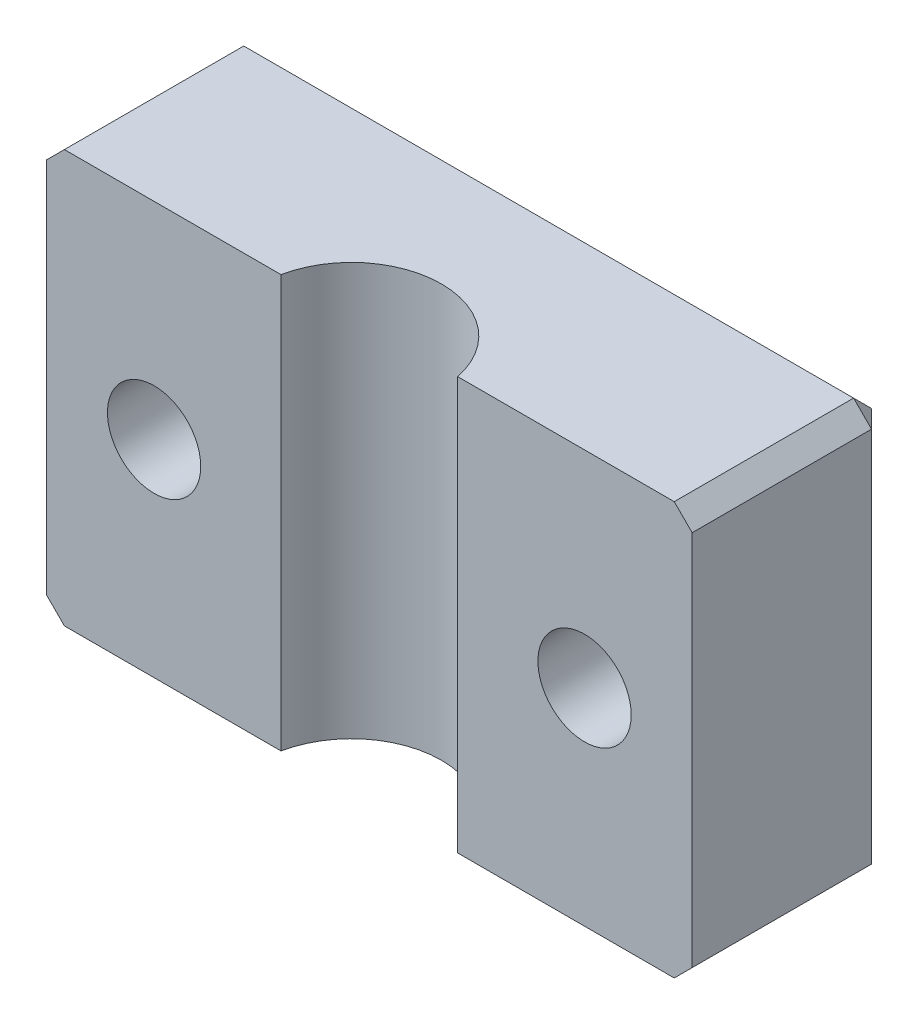
ISO-10303-21;
HEADER;
FILE_DESCRIPTION(('STEP AP214'),'2;1');
FILE_NAME('part.step','',(''),(''),'','','');
FILE_SCHEMA(('AUTOMOTIVE_DESIGN { 1 0 10303 214 1 1 1 1 }'));
ENDSEC;
DATA;
#1=APPLICATION_CONTEXT('core data for automotive mechanical design processes');
#2=APPLICATION_PROTOCOL_DEFINITION('international standard','automotive_design',2000,#1);
#3=PRODUCT_CONTEXT('',#1,'mechanical');
#4=PRODUCT('Part','Part','',(#3));
#5=PRODUCT_RELATED_PRODUCT_CATEGORY('part','',(#4));
#6=PRODUCT_DEFINITION_FORMATION('','',#4);
#7=PRODUCT_DEFINITION_CONTEXT('part definition',#1,'design');
#8=PRODUCT_DEFINITION('design','',#6,#7);
#9=PRODUCT_DEFINITION_SHAPE('','',#8);
#10=(LENGTH_UNIT() NAMED_UNIT(*) SI_UNIT(.MILLI.,.METRE.));
#11=(NAMED_UNIT(*) PLANE_ANGLE_UNIT() SI_UNIT($,.RADIAN.));
#12=(NAMED_UNIT(*) SI_UNIT($,.STERADIAN.) SOLID_ANGLE_UNIT());
#13=UNCERTAINTY_MEASURE_WITH_UNIT(LENGTH_MEASURE(1.E-05),#10,'distance_accuracy_value','');
#14=(GEOMETRIC_REPRESENTATION_CONTEXT(3) GLOBAL_UNCERTAINTY_ASSIGNED_CONTEXT((#13)) GLOBAL_UNIT_ASSIGNED_CONTEXT((#10,
#11,#12)) REPRESENTATION_CONTEXT('',''));
#15=CARTESIAN_POINT('',(0.,0.,0.));
#16=DIRECTION('',(0.,0.,1.));
#17=DIRECTION('',(1.,0.,0.));
#18=AXIS2_PLACEMENT_3D('',#15,#16,#17);
#19=CARTESIAN_POINT('',(-18.,23.,11.));
#20=DIRECTION('',(1.,0.,0.));
#21=DIRECTION('',(0.,0.,-1.));
#22=AXIS2_PLACEMENT_3D('',#19,#20,#21);
#23=PLANE('',#22);
#24=DIRECTION('',(0.,-1.,0.));
#25=VECTOR('',#24,1.);
#26=CARTESIAN_POINT('',(-18.,23.,1.));
#27=LINE('',#26,#25);
#28=CARTESIAN_POINT('',(-18.,22.,1.));
#29=VERTEX_POINT('',#28);
#30=CARTESIAN_POINT('',(-18.,1.,1.));
#31=VERTEX_POINT('',#30);
#32=EDGE_CURVE('E180',#29,#31,#27,.T.);
#33=ORIENTED_EDGE('',*,*,#32,.T.);
#34=DIRECTION('',(0.,0.,1.));
#35=VECTOR('',#34,1.);
#36=CARTESIAN_POINT('',(-18.,1.,11.));
#37=LINE('',#36,#35);
#38=CARTESIAN_POINT('',(-18.,1.00000000000001,11.));
#39=VERTEX_POINT('',#38);
#40=EDGE_CURVE('E184',#31,#39,#37,.T.);
#41=ORIENTED_EDGE('',*,*,#40,.T.);
#42=DIRECTION('',(0.,-1.,0.));
#43=VECTOR('',#42,1.);
#44=CARTESIAN_POINT('',(-18.,23.,11.));
#45=LINE('',#44,#43);
#46=CARTESIAN_POINT('',(-18.,22.,11.));
#47=VERTEX_POINT('',#46);
#48=EDGE_CURVE('E141',#47,#39,#45,.T.);
#49=ORIENTED_EDGE('',*,*,#48,.F.);
#50=DIRECTION('',(0.,0.,-1.));
#51=VECTOR('',#50,1.);
#52=CARTESIAN_POINT('',(-18.,22.,0.));
#53=LINE('',#52,#51);
#54=EDGE_CURVE('E182',#47,#29,#53,.T.);
#55=ORIENTED_EDGE('',*,*,#54,.T.);
#56=EDGE_LOOP('',(#33,#41,#49,#55));
#57=FACE_BOUND('',#56,.T.);
#58=ADVANCED_FACE('F33',(#57),#23,.F.);
#59=CARTESIAN_POINT('',(-4.92449235962449,23.,11.));
#60=DIRECTION('',(0.,0.,-1.));
#61=DIRECTION('',(-1.,0.,0.));
#62=AXIS2_PLACEMENT_3D('',#59,#60,#61);
#63=PLANE('',#62);
#64=CARTESIAN_POINT('',(-12.,11.5,11.));
#65=DIRECTION('',(0.,0.,1.));
#66=DIRECTION('',(1.,0.,0.));
#67=AXIS2_PLACEMENT_3D('',#64,#65,#66);
#68=CIRCLE('',#67,2.6);
#69=CARTESIAN_POINT('',(-9.4,11.5,11.));
#70=VERTEX_POINT('',#69);
#71=EDGE_CURVE('E243',#70,#70,#68,.T.);
#72=ORIENTED_EDGE('',*,*,#71,.F.);
#73=EDGE_LOOP('',(#72));
#74=FACE_BOUND('',#73,.T.);
#75=ORIENTED_EDGE('',*,*,#48,.T.);
#76=DIRECTION('',(-0.707106781186549,0.707106781186546,0.));
#77=VECTOR('',#76,1.);
#78=CARTESIAN_POINT('',(-18.,1.,11.));
#79=LINE('',#78,#77);
#80=CARTESIAN_POINT('',(-17.,0.,11.));
#81=VERTEX_POINT('',#80);
#82=EDGE_CURVE('E188',#39,#81,#79,.F.);
#83=ORIENTED_EDGE('',*,*,#82,.T.);
#84=DIRECTION('',(1.,0.,0.));
#85=VECTOR('',#84,1.);
#86=CARTESIAN_POINT('',(-4.92449235962449,0.,11.));
#87=LINE('',#86,#85);
#88=CARTESIAN_POINT('',(-4.92449235962449,0.,11.));
#89=VERTEX_POINT('',#88);
#90=EDGE_CURVE('E138',#81,#89,#87,.T.);
#91=ORIENTED_EDGE('',*,*,#90,.T.);
#92=DIRECTION('',(0.,-1.,0.));
#93=VECTOR('',#92,1.);
#94=CARTESIAN_POINT('',(-4.92449235962449,23.,11.));
#95=LINE('',#94,#93);
#96=CARTESIAN_POINT('',(-4.92449235962449,23.,11.));
#97=VERTEX_POINT('',#96);
#98=EDGE_CURVE('E134',#97,#89,#95,.T.);
#99=ORIENTED_EDGE('',*,*,#98,.F.);
#100=DIRECTION('',(1.,0.,0.));
#101=VECTOR('',#100,1.);
#102=CARTESIAN_POINT('',(-4.92449235962449,23.,11.));
#103=LINE('',#102,#101);
#104=CARTESIAN_POINT('',(-17.,23.,11.));
#105=VERTEX_POINT('',#104);
#106=EDGE_CURVE('E120',#105,#97,#103,.T.);
#107=ORIENTED_EDGE('',*,*,#106,.F.);
#108=DIRECTION('',(-0.707106781186546,-0.707106781186549,0.));
#109=VECTOR('',#108,1.);
#110=CARTESIAN_POINT('',(-17.,23.,11.));
#111=LINE('',#110,#109);
#112=EDGE_CURVE('E186',#105,#47,#111,.T.);
#113=ORIENTED_EDGE('',*,*,#112,.T.);
#114=EDGE_LOOP('',(#75,#83,#91,#99,#107,#113));
#115=FACE_BOUND('',#114,.T.);
#116=ADVANCED_FACE('F136',(#74,#115),#63,.F.);
#117=CARTESIAN_POINT('',(0.,23.,12.));
#118=DIRECTION('',(0.,-1.,0.));
#119=DIRECTION('',(0.,0.,-1.));
#120=AXIS2_PLACEMENT_3D('',#117,#118,#119);
#121=CYLINDRICAL_SURFACE('',#120,5.025);
#122=CARTESIAN_POINT('',(0.,0.,12.));
#123=DIRECTION('',(0.,-1.,0.));
#124=DIRECTION('',(0.,0.,1.));
#125=AXIS2_PLACEMENT_3D('',#122,#123,#124);
#126=CIRCLE('',#125,5.025);
#127=CARTESIAN_POINT('',(4.9244923596245,0.,11.));
#128=VERTEX_POINT('',#127);
#129=EDGE_CURVE('E154',#89,#128,#126,.T.);
#130=ORIENTED_EDGE('',*,*,#129,.T.);
#131=DIRECTION('',(0.,-1.,0.));
#132=VECTOR('',#131,1.);
#133=CARTESIAN_POINT('',(4.9244923596245,23.,11.));
#134=LINE('',#133,#132);
#135=CARTESIAN_POINT('',(4.9244923596245,23.,11.));
#136=VERTEX_POINT('',#135);
#137=EDGE_CURVE('E142',#136,#128,#134,.T.);
#138=ORIENTED_EDGE('',*,*,#137,.F.);
#139=CARTESIAN_POINT('',(0.,23.,12.));
#140=DIRECTION('',(0.,-1.,0.));
#141=DIRECTION('',(0.,0.,1.));
#142=AXIS2_PLACEMENT_3D('',#139,#140,#141);
#143=CIRCLE('',#142,5.025);
#144=EDGE_CURVE('E125',#97,#136,#143,.T.);
#145=ORIENTED_EDGE('',*,*,#144,.F.);
#146=ORIENTED_EDGE('',*,*,#98,.T.);
#147=EDGE_LOOP('',(#130,#138,#145,#146));
#148=FACE_BOUND('',#147,.T.);
#149=ADVANCED_FACE('F144',(#148),#121,.F.);
#150=CARTESIAN_POINT('',(18.,23.,11.));
#151=DIRECTION('',(0.,0.,-1.));
#152=DIRECTION('',(-1.,0.,0.));
#153=AXIS2_PLACEMENT_3D('',#150,#151,#152);
#154=PLANE('',#153);
#155=CARTESIAN_POINT('',(12.,11.5,11.));
#156=DIRECTION('',(0.,0.,1.));
#157=DIRECTION('',(1.,0.,0.));
#158=AXIS2_PLACEMENT_3D('',#155,#156,#157);
#159=CIRCLE('',#158,2.6);
#160=CARTESIAN_POINT('',(14.6,11.5,11.));
#161=VERTEX_POINT('',#160);
#162=EDGE_CURVE('E233',#161,#161,#159,.T.);
#163=ORIENTED_EDGE('',*,*,#162,.F.);
#164=EDGE_LOOP('',(#163));
#165=FACE_BOUND('',#164,.T.);
#166=DIRECTION('',(1.,0.,0.));
#167=VECTOR('',#166,1.);
#168=CARTESIAN_POINT('',(18.,0.,11.));
#169=LINE('',#168,#167);
#170=CARTESIAN_POINT('',(17.,0.,11.));
#171=VERTEX_POINT('',#170);
#172=EDGE_CURVE('E131',#128,#171,#169,.T.);
#173=ORIENTED_EDGE('',*,*,#172,.T.);
#174=DIRECTION('',(-0.707106781186549,-0.707106781186546,0.));
#175=VECTOR('',#174,1.);
#176=CARTESIAN_POINT('',(18.,1.,11.));
#177=LINE('',#176,#175);
#178=CARTESIAN_POINT('',(18.,1.00000000000001,11.));
#179=VERTEX_POINT('',#178);
#180=EDGE_CURVE('E178',#171,#179,#177,.F.);
#181=ORIENTED_EDGE('',*,*,#180,.T.);
#182=DIRECTION('',(0.,-1.,0.));
#183=VECTOR('',#182,1.);
#184=CARTESIAN_POINT('',(18.,23.,11.));
#185=LINE('',#184,#183);
#186=CARTESIAN_POINT('',(18.,22.,11.));
#187=VERTEX_POINT('',#186);
#188=EDGE_CURVE('E149',#187,#179,#185,.T.);
#189=ORIENTED_EDGE('',*,*,#188,.F.);
#190=DIRECTION('',(-0.707106781186546,0.707106781186549,0.));
#191=VECTOR('',#190,1.);
#192=CARTESIAN_POINT('',(17.,23.,11.));
#193=LINE('',#192,#191);
#194=CARTESIAN_POINT('',(17.,23.,11.));
#195=VERTEX_POINT('',#194);
#196=EDGE_CURVE('E176',#187,#195,#193,.T.);
#197=ORIENTED_EDGE('',*,*,#196,.T.);
#198=DIRECTION('',(1.,0.,0.));
#199=VECTOR('',#198,1.);
#200=CARTESIAN_POINT('',(18.,23.,11.));
#201=LINE('',#200,#199);
#202=EDGE_CURVE('E147',#136,#195,#201,.T.);
#203=ORIENTED_EDGE('',*,*,#202,.F.);
#204=ORIENTED_EDGE('',*,*,#137,.T.);
#205=EDGE_LOOP('',(#173,#181,#189,#197,#203,#204));
#206=FACE_BOUND('',#205,.T.);
#207=ADVANCED_FACE('F262',(#165,#206),#154,.F.);
#208=CARTESIAN_POINT('',(18.,23.,0.));
#209=DIRECTION('',(-1.,0.,0.));
#210=DIRECTION('',(0.,0.,1.));
#211=AXIS2_PLACEMENT_3D('',#208,#209,#210);
#212=PLANE('',#211);
#213=ORIENTED_EDGE('',*,*,#188,.T.);
#214=DIRECTION('',(0.,0.,-1.));
#215=VECTOR('',#214,1.);
#216=CARTESIAN_POINT('',(18.,1.,0.));
#217=LINE('',#216,#215);
#218=CARTESIAN_POINT('',(18.,1.,0.999999999999997));
#219=VERTEX_POINT('',#218);
#220=EDGE_CURVE('E167',#179,#219,#217,.T.);
#221=ORIENTED_EDGE('',*,*,#220,.T.);
#222=DIRECTION('',(0.,1.,0.));
#223=VECTOR('',#222,1.);
#224=CARTESIAN_POINT('',(18.,23.,0.999999999999997));
#225=LINE('',#224,#223);
#226=CARTESIAN_POINT('',(18.,22.,0.999999999999997));
#227=VERTEX_POINT('',#226);
#228=EDGE_CURVE('E163',#219,#227,#225,.T.);
#229=ORIENTED_EDGE('',*,*,#228,.T.);
#230=DIRECTION('',(0.,0.,1.));
#231=VECTOR('',#230,1.);
#232=CARTESIAN_POINT('',(18.,22.,11.));
#233=LINE('',#232,#231);
#234=EDGE_CURVE('E165',#227,#187,#233,.T.);
#235=ORIENTED_EDGE('',*,*,#234,.T.);
#236=EDGE_LOOP('',(#213,#221,#229,#235));
#237=FACE_BOUND('',#236,.T.);
#238=ADVANCED_FACE('F254',(#237),#212,.F.);
#239=CARTESIAN_POINT('',(-18.,23.,0.));
#240=DIRECTION('',(0.,0.,1.));
#241=DIRECTION('',(1.,0.,0.));
#242=AXIS2_PLACEMENT_3D('',#239,#240,#241);
#243=PLANE('',#242);
#244=DIRECTION('',(-1.,0.,0.));
#245=VECTOR('',#244,1.);
#246=CARTESIAN_POINT('',(-18.,1.,0.));
#247=LINE('',#246,#245);
#248=CARTESIAN_POINT('',(17.,1.,0.));
#249=VERTEX_POINT('',#248);
#250=CARTESIAN_POINT('',(-17.,1.,0.));
#251=VERTEX_POINT('',#250);
#252=EDGE_CURVE('E42',#249,#251,#247,.T.);
#253=ORIENTED_EDGE('',*,*,#252,.T.);
#254=DIRECTION('',(0.,1.,0.));
#255=VECTOR('',#254,1.);
#256=CARTESIAN_POINT('',(-17.,23.,0.));
#257=LINE('',#256,#255);
#258=CARTESIAN_POINT('',(-17.,22.,0.));
#259=VERTEX_POINT('',#258);
#260=EDGE_CURVE('E11',#251,#259,#257,.T.);
#261=ORIENTED_EDGE('',*,*,#260,.T.);
#262=DIRECTION('',(1.,0.,0.));
#263=VECTOR('',#262,1.);
#264=CARTESIAN_POINT('',(18.,22.,0.));
#265=LINE('',#264,#263);
#266=CARTESIAN_POINT('',(17.,22.,0.));
#267=VERTEX_POINT('',#266);
#268=EDGE_CURVE('E195',#259,#267,#265,.T.);
#269=ORIENTED_EDGE('',*,*,#268,.T.);
#270=DIRECTION('',(0.,-1.,0.));
#271=VECTOR('',#270,1.);
#272=CARTESIAN_POINT('',(17.,23.,0.));
#273=LINE('',#272,#271);
#274=EDGE_CURVE('E53',#267,#249,#273,.T.);
#275=ORIENTED_EDGE('',*,*,#274,.T.);
#276=EDGE_LOOP('',(#253,#261,#269,#275));
#277=FACE_BOUND('',#276,.T.);
#278=CARTESIAN_POINT('',(12.,11.5,0.));
#279=DIRECTION('',(0.,0.,1.));
#280=DIRECTION('',(1.,0.,0.));
#281=AXIS2_PLACEMENT_3D('',#278,#279,#280);
#282=CIRCLE('',#281,2.6);
#283=CARTESIAN_POINT('',(14.6,11.5,0.));
#284=VERTEX_POINT('',#283);
#285=EDGE_CURVE('E238',#284,#284,#282,.F.);
#286=ORIENTED_EDGE('',*,*,#285,.F.);
#287=EDGE_LOOP('',(#286));
#288=FACE_BOUND('',#287,.T.);
#289=CARTESIAN_POINT('',(-12.,11.5,0.));
#290=DIRECTION('',(0.,0.,1.));
#291=DIRECTION('',(1.,0.,0.));
#292=AXIS2_PLACEMENT_3D('',#289,#290,#291);
#293=CIRCLE('',#292,2.6);
#294=CARTESIAN_POINT('',(-9.4,11.5,0.));
#295=VERTEX_POINT('',#294);
#296=EDGE_CURVE('E155',#295,#295,#293,.F.);
#297=ORIENTED_EDGE('',*,*,#296,.F.);
#298=EDGE_LOOP('',(#297));
#299=FACE_BOUND('',#298,.T.);
#300=ADVANCED_FACE('F252',(#277,#288,#299),#243,.F.);
#301=CARTESIAN_POINT('',(0.,23.,12.));
#302=DIRECTION('',(0.,1.,0.));
#303=DIRECTION('',(0.,0.,1.));
#304=AXIS2_PLACEMENT_3D('',#301,#302,#303);
#305=PLANE('',#304);
#306=DIRECTION('',(-1.,0.,0.));
#307=VECTOR('',#306,1.);
#308=CARTESIAN_POINT('',(-18.,23.,1.));
#309=LINE('',#308,#307);
#310=CARTESIAN_POINT('',(17.,23.,0.999999999999997));
#311=VERTEX_POINT('',#310);
#312=CARTESIAN_POINT('',(-17.,23.,1.));
#313=VERTEX_POINT('',#312);
#314=EDGE_CURVE('E190',#311,#313,#309,.T.);
#315=ORIENTED_EDGE('',*,*,#314,.T.);
#316=DIRECTION('',(0.,0.,1.));
#317=VECTOR('',#316,1.);
#318=CARTESIAN_POINT('',(-17.,23.,11.));
#319=LINE('',#318,#317);
#320=EDGE_CURVE('E128',#313,#105,#319,.T.);
#321=ORIENTED_EDGE('',*,*,#320,.T.);
#322=ORIENTED_EDGE('',*,*,#106,.T.);
#323=ORIENTED_EDGE('',*,*,#144,.T.);
#324=ORIENTED_EDGE('',*,*,#202,.T.);
#325=DIRECTION('',(0.,0.,-1.));
#326=VECTOR('',#325,1.);
#327=CARTESIAN_POINT('',(17.,23.,0.));
#328=LINE('',#327,#326);
#329=EDGE_CURVE('E192',#195,#311,#328,.T.);
#330=ORIENTED_EDGE('',*,*,#329,.T.);
#331=EDGE_LOOP('',(#315,#321,#322,#323,#324,#330));
#332=FACE_BOUND('',#331,.T.);
#333=ADVANCED_FACE('F122',(#332),#305,.T.);
#334=CARTESIAN_POINT('',(0.,0.,12.));
#335=DIRECTION('',(0.,1.,0.));
#336=DIRECTION('',(0.,0.,1.));
#337=AXIS2_PLACEMENT_3D('',#334,#335,#336);
#338=PLANE('',#337);
#339=DIRECTION('',(1.,0.,0.));
#340=VECTOR('',#339,1.);
#341=CARTESIAN_POINT('',(0.,0.,0.999999999999999));
#342=LINE('',#341,#340);
#343=CARTESIAN_POINT('',(-17.,0.,1.));
#344=VERTEX_POINT('',#343);
#345=CARTESIAN_POINT('',(17.,0.,0.999999999999997));
#346=VERTEX_POINT('',#345);
#347=EDGE_CURVE('E170',#344,#346,#342,.T.);
#348=ORIENTED_EDGE('',*,*,#347,.T.);
#349=DIRECTION('',(0.,0.,1.));
#350=VECTOR('',#349,1.);
#351=CARTESIAN_POINT('',(17.,0.,12.));
#352=LINE('',#351,#350);
#353=EDGE_CURVE('E174',#346,#171,#352,.T.);
#354=ORIENTED_EDGE('',*,*,#353,.T.);
#355=ORIENTED_EDGE('',*,*,#172,.F.);
#356=ORIENTED_EDGE('',*,*,#129,.F.);
#357=ORIENTED_EDGE('',*,*,#90,.F.);
#358=DIRECTION('',(0.,0.,-1.));
#359=VECTOR('',#358,1.);
#360=CARTESIAN_POINT('',(-17.,0.,12.));
#361=LINE('',#360,#359);
#362=EDGE_CURVE('E172',#81,#344,#361,.T.);
#363=ORIENTED_EDGE('',*,*,#362,.T.);
#364=EDGE_LOOP('',(#348,#354,#355,#356,#357,#363));
#365=FACE_BOUND('',#364,.T.);
#366=ADVANCED_FACE('F260',(#365),#338,.F.);
#367=CARTESIAN_POINT('',(-12.,11.5,-0.00100000000000447));
#368=DIRECTION('',(0.,0.,1.));
#369=DIRECTION('',(1.,0.,0.));
#370=AXIS2_PLACEMENT_3D('',#367,#368,#369);
#371=CYLINDRICAL_SURFACE('',#370,2.6);
#372=ORIENTED_EDGE('',*,*,#71,.T.);
#373=EDGE_LOOP('',(#372));
#374=FACE_BOUND('',#373,.T.);
#375=ORIENTED_EDGE('',*,*,#296,.T.);
#376=EDGE_LOOP('',(#375));
#377=FACE_BOUND('',#376,.T.);
#378=ADVANCED_FACE('F250',(#374,#377),#371,.F.);
#379=CARTESIAN_POINT('',(12.,11.5,-0.00100000000000447));
#380=DIRECTION('',(0.,0.,1.));
#381=DIRECTION('',(1.,0.,0.));
#382=AXIS2_PLACEMENT_3D('',#379,#380,#381);
#383=CYLINDRICAL_SURFACE('',#382,2.6);
#384=ORIENTED_EDGE('',*,*,#162,.T.);
#385=EDGE_LOOP('',(#384));
#386=FACE_BOUND('',#385,.T.);
#387=ORIENTED_EDGE('',*,*,#285,.T.);
#388=EDGE_LOOP('',(#387));
#389=FACE_BOUND('',#388,.T.);
#390=ADVANCED_FACE('F320',(#386,#389),#383,.F.);
#391=CARTESIAN_POINT('',(-17.,23.,12.));
#392=DIRECTION('',(-0.707106781186549,0.707106781186546,0.));
#393=DIRECTION('',(0.,0.,-1.));
#394=AXIS2_PLACEMENT_3D('',#391,#392,#393);
#395=PLANE('',#394);
#396=DIRECTION('',(0.707106781186546,0.707106781186549,0.));
#397=VECTOR('',#396,1.);
#398=CARTESIAN_POINT('',(-18.,22.,1.));
#399=LINE('',#398,#397);
#400=EDGE_CURVE('E37',#29,#313,#399,.T.);
#401=ORIENTED_EDGE('',*,*,#400,.F.);
#402=ORIENTED_EDGE('',*,*,#54,.F.);
#403=ORIENTED_EDGE('',*,*,#112,.F.);
#404=ORIENTED_EDGE('',*,*,#320,.F.);
#405=EDGE_LOOP('',(#401,#402,#403,#404));
#406=FACE_BOUND('',#405,.T.);
#407=ADVANCED_FACE('F35',(#406),#395,.T.);
#408=CARTESIAN_POINT('',(-18.,22.,1.));
#409=DIRECTION('',(-0.577350269189626,0.577350269189624,-0.577350269189628));
#410=DIRECTION('',(-0.707106781186549,0.,0.707106781186546));
#411=AXIS2_PLACEMENT_3D('',#408,#409,#410);
#412=PLANE('',#411);
#413=DIRECTION('',(0.707106781186549,0.,-0.707106781186546));
#414=VECTOR('',#413,1.);
#415=CARTESIAN_POINT('',(-18.,22.,1.));
#416=LINE('',#415,#414);
#417=EDGE_CURVE('E225',#29,#259,#416,.T.);
#418=ORIENTED_EDGE('',*,*,#417,.F.);
#419=ORIENTED_EDGE('',*,*,#400,.T.);
#420=DIRECTION('',(0.,-0.707106781186549,-0.707106781186546));
#421=VECTOR('',#420,1.);
#422=CARTESIAN_POINT('',(-17.,22.5,0.5));
#423=LINE('',#422,#421);
#424=EDGE_CURVE('E227',#259,#313,#423,.F.);
#425=ORIENTED_EDGE('',*,*,#424,.F.);
#426=EDGE_LOOP('',(#418,#419,#425));
#427=FACE_BOUND('',#426,.T.);
#428=ADVANCED_FACE('F314',(#427),#412,.T.);
#429=CARTESIAN_POINT('',(17.,23.,12.));
#430=DIRECTION('',(0.707106781186549,0.707106781186546,0.));
#431=DIRECTION('',(0.,0.,1.));
#432=AXIS2_PLACEMENT_3D('',#429,#430,#431);
#433=PLANE('',#432);
#434=ORIENTED_EDGE('',*,*,#196,.F.);
#435=ORIENTED_EDGE('',*,*,#234,.F.);
#436=DIRECTION('',(0.707106781186546,-0.707106781186549,0.));
#437=VECTOR('',#436,1.);
#438=CARTESIAN_POINT('',(17.,23.,0.999999999999997));
#439=LINE('',#438,#437);
#440=EDGE_CURVE('E222',#311,#227,#439,.T.);
#441=ORIENTED_EDGE('',*,*,#440,.F.);
#442=ORIENTED_EDGE('',*,*,#329,.F.);
#443=EDGE_LOOP('',(#434,#435,#441,#442));
#444=FACE_BOUND('',#443,.T.);
#445=ADVANCED_FACE('F312',(#444),#433,.T.);
#446=CARTESIAN_POINT('',(0.,23.,0.999999999999999));
#447=DIRECTION('',(0.,0.707106781186546,-0.707106781186549));
#448=DIRECTION('',(1.,0.,0.));
#449=AXIS2_PLACEMENT_3D('',#446,#447,#448);
#450=PLANE('',#449);
#451=ORIENTED_EDGE('',*,*,#424,.T.);
#452=ORIENTED_EDGE('',*,*,#314,.F.);
#453=DIRECTION('',(0.,0.707106781186548,0.707106781186546));
#454=VECTOR('',#453,1.);
#455=CARTESIAN_POINT('',(17.,23.,0.999999999999997));
#456=LINE('',#455,#454);
#457=EDGE_CURVE('E219',#267,#311,#456,.T.);
#458=ORIENTED_EDGE('',*,*,#457,.F.);
#459=ORIENTED_EDGE('',*,*,#268,.F.);
#460=EDGE_LOOP('',(#451,#452,#458,#459));
#461=FACE_BOUND('',#460,.T.);
#462=ADVANCED_FACE('F308',(#461),#450,.T.);
#463=CARTESIAN_POINT('',(-18.,23.,1.));
#464=DIRECTION('',(0.707106781186546,0.,0.707106781186549));
#465=DIRECTION('',(0.,-1.,0.));
#466=AXIS2_PLACEMENT_3D('',#463,#464,#465);
#467=PLANE('',#466);
#468=ORIENTED_EDGE('',*,*,#417,.T.);
#469=ORIENTED_EDGE('',*,*,#260,.F.);
#470=DIRECTION('',(-0.707106781186549,0.,0.707106781186546));
#471=VECTOR('',#470,1.);
#472=CARTESIAN_POINT('',(-17.5,1.,0.5));
#473=LINE('',#472,#471);
#474=EDGE_CURVE('E216',#31,#251,#473,.F.);
#475=ORIENTED_EDGE('',*,*,#474,.F.);
#476=ORIENTED_EDGE('',*,*,#32,.F.);
#477=EDGE_LOOP('',(#468,#469,#475,#476));
#478=FACE_BOUND('',#477,.T.);
#479=ADVANCED_FACE('F304',(#478),#467,.F.);
#480=CARTESIAN_POINT('',(-18.,1.,11.));
#481=DIRECTION('',(0.707106781186546,0.707106781186549,0.));
#482=DIRECTION('',(0.,0.,1.));
#483=AXIS2_PLACEMENT_3D('',#480,#481,#482);
#484=PLANE('',#483);
#485=ORIENTED_EDGE('',*,*,#82,.F.);
#486=ORIENTED_EDGE('',*,*,#40,.F.);
#487=DIRECTION('',(0.707106781186549,-0.707106781186546,0.));
#488=VECTOR('',#487,1.);
#489=CARTESIAN_POINT('',(-17.,0.,1.));
#490=LINE('',#489,#488);
#491=EDGE_CURVE('E213',#344,#31,#490,.F.);
#492=ORIENTED_EDGE('',*,*,#491,.F.);
#493=ORIENTED_EDGE('',*,*,#362,.F.);
#494=EDGE_LOOP('',(#485,#486,#492,#493));
#495=FACE_BOUND('',#494,.T.);
#496=ADVANCED_FACE('F300',(#495),#484,.F.);
#497=CARTESIAN_POINT('',(17.,23.,0.999999999999997));
#498=DIRECTION('',(0.577350269189625,0.577350269189623,-0.577350269189629));
#499=DIRECTION('',(-0.70710678118655,0.,-0.707106781186545));
#500=AXIS2_PLACEMENT_3D('',#497,#498,#499);
#501=PLANE('',#500);
#502=ORIENTED_EDGE('',*,*,#457,.T.);
#503=ORIENTED_EDGE('',*,*,#440,.T.);
#504=DIRECTION('',(0.70710678118655,0.,0.707106781186545));
#505=VECTOR('',#504,1.);
#506=CARTESIAN_POINT('',(17.5,22.,0.499999999999996));
#507=LINE('',#506,#505);
#508=EDGE_CURVE('E210',#267,#227,#507,.T.);
#509=ORIENTED_EDGE('',*,*,#508,.F.);
#510=EDGE_LOOP('',(#502,#503,#509));
#511=FACE_BOUND('',#510,.T.);
#512=ADVANCED_FACE('F296',(#511),#501,.T.);
#513=CARTESIAN_POINT('',(-17.,0.,1.));
#514=DIRECTION('',(-0.577350269189624,-0.577350269189626,-0.577350269189628));
#515=DIRECTION('',(0.,0.707106781186548,-0.707106781186547));
#516=AXIS2_PLACEMENT_3D('',#513,#514,#515);
#517=PLANE('',#516);
#518=ORIENTED_EDGE('',*,*,#491,.T.);
#519=ORIENTED_EDGE('',*,*,#474,.T.);
#520=DIRECTION('',(0.,0.707106781186549,-0.707106781186546));
#521=VECTOR('',#520,1.);
#522=CARTESIAN_POINT('',(-17.,0.,1.));
#523=LINE('',#522,#521);
#524=EDGE_CURVE('E207',#344,#251,#523,.T.);
#525=ORIENTED_EDGE('',*,*,#524,.F.);
#526=EDGE_LOOP('',(#518,#519,#525));
#527=FACE_BOUND('',#526,.T.);
#528=ADVANCED_FACE('F292',(#527),#517,.T.);
#529=CARTESIAN_POINT('',(17.,23.,0.));
#530=DIRECTION('',(-0.707106781186545,0.,0.70710678118655));
#531=DIRECTION('',(0.,-1.,0.));
#532=AXIS2_PLACEMENT_3D('',#529,#530,#531);
#533=PLANE('',#532);
#534=ORIENTED_EDGE('',*,*,#508,.T.);
#535=ORIENTED_EDGE('',*,*,#228,.F.);
#536=DIRECTION('',(-0.70710678118655,0.,-0.707106781186545));
#537=VECTOR('',#536,1.);
#538=CARTESIAN_POINT('',(18.,1.,0.999999999999997));
#539=LINE('',#538,#537);
#540=EDGE_CURVE('E204',#249,#219,#539,.F.);
#541=ORIENTED_EDGE('',*,*,#540,.F.);
#542=ORIENTED_EDGE('',*,*,#274,.F.);
#543=EDGE_LOOP('',(#534,#535,#541,#542));
#544=FACE_BOUND('',#543,.T.);
#545=ADVANCED_FACE('F288',(#544),#533,.F.);
#546=CARTESIAN_POINT('',(-18.,1.,0.));
#547=DIRECTION('',(0.,0.707106781186546,0.707106781186549));
#548=DIRECTION('',(-1.,0.,0.));
#549=AXIS2_PLACEMENT_3D('',#546,#547,#548);
#550=PLANE('',#549);
#551=ORIENTED_EDGE('',*,*,#524,.T.);
#552=ORIENTED_EDGE('',*,*,#252,.F.);
#553=DIRECTION('',(0.,-0.707106781186549,0.707106781186547));
#554=VECTOR('',#553,1.);
#555=CARTESIAN_POINT('',(17.,0.500000000000001,0.499999999999998));
#556=LINE('',#555,#554);
#557=EDGE_CURVE('E201',#346,#249,#556,.F.);
#558=ORIENTED_EDGE('',*,*,#557,.F.);
#559=ORIENTED_EDGE('',*,*,#347,.F.);
#560=EDGE_LOOP('',(#551,#552,#558,#559));
#561=FACE_BOUND('',#560,.T.);
#562=ADVANCED_FACE('F284',(#561),#550,.F.);
#563=CARTESIAN_POINT('',(18.,1.,0.999999999999997));
#564=DIRECTION('',(0.577350269189623,-0.577350269189625,-0.577350269189629));
#565=DIRECTION('',(0.,0.70710678118655,-0.707106781186545));
#566=AXIS2_PLACEMENT_3D('',#563,#564,#565);
#567=PLANE('',#566);
#568=ORIENTED_EDGE('',*,*,#557,.T.);
#569=ORIENTED_EDGE('',*,*,#540,.T.);
#570=DIRECTION('',(0.707106781186549,0.707106781186546,0.));
#571=VECTOR('',#570,1.);
#572=CARTESIAN_POINT('',(18.,1.,0.999999999999997));
#573=LINE('',#572,#571);
#574=EDGE_CURVE('E199',#346,#219,#573,.T.);
#575=ORIENTED_EDGE('',*,*,#574,.F.);
#576=EDGE_LOOP('',(#568,#569,#575));
#577=FACE_BOUND('',#576,.T.);
#578=ADVANCED_FACE('F280',(#577),#567,.T.);
#579=CARTESIAN_POINT('',(18.,1.,0.));
#580=DIRECTION('',(-0.707106781186546,0.707106781186549,0.));
#581=DIRECTION('',(0.,0.,-1.));
#582=AXIS2_PLACEMENT_3D('',#579,#580,#581);
#583=PLANE('',#582);
#584=ORIENTED_EDGE('',*,*,#180,.F.);
#585=ORIENTED_EDGE('',*,*,#353,.F.);
#586=ORIENTED_EDGE('',*,*,#574,.T.);
#587=ORIENTED_EDGE('',*,*,#220,.F.);
#588=EDGE_LOOP('',(#584,#585,#586,#587));
#589=FACE_BOUND('',#588,.T.);
#590=ADVANCED_FACE('F277',(#589),#583,.F.);
#591=CLOSED_SHELL('',(#58,#116,#149,#207,#238,#300,#333,#366,#378,#390,#407,#428,#445,#462,#479,
#496,#512,#528,#545,#562,#578,#590));
#592=MANIFOLD_SOLID_BREP('B2',#591);
#593=ADVANCED_BREP_SHAPE_REPRESENTATION('',(#18,#592),#14);
#594=SHAPE_DEFINITION_REPRESENTATION(#9,#593);
ENDSEC;
END-ISO-10303-21;
